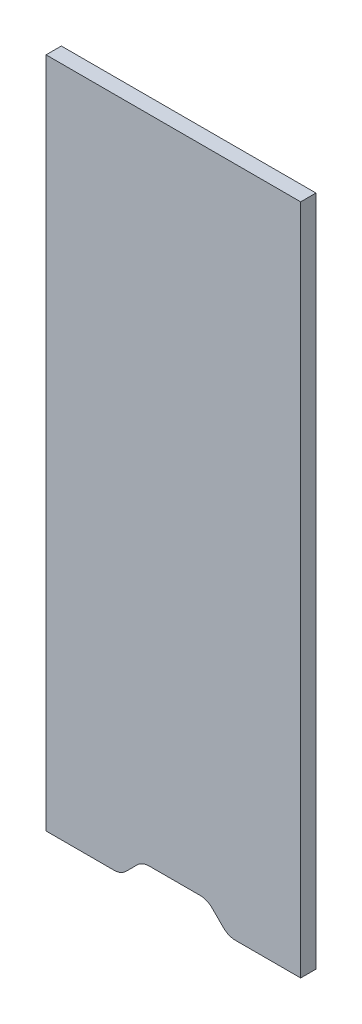
ISO-10303-21;
HEADER;
FILE_DESCRIPTION(('STEP AP214'),'2;1');
FILE_NAME('part.step','',(''),(''),'','','');
FILE_SCHEMA(('AUTOMOTIVE_DESIGN { 1 0 10303 214 1 1 1 1 }'));
ENDSEC;
DATA;
#1=APPLICATION_CONTEXT('core data for automotive mechanical design processes');
#2=APPLICATION_PROTOCOL_DEFINITION('international standard','automotive_design',2000,#1);
#3=PRODUCT_CONTEXT('',#1,'mechanical');
#4=PRODUCT('Part','Part','',(#3));
#5=PRODUCT_RELATED_PRODUCT_CATEGORY('part','',(#4));
#6=PRODUCT_DEFINITION_FORMATION('','',#4);
#7=PRODUCT_DEFINITION_CONTEXT('part definition',#1,'design');
#8=PRODUCT_DEFINITION('design','',#6,#7);
#9=PRODUCT_DEFINITION_SHAPE('','',#8);
#10=(LENGTH_UNIT() NAMED_UNIT(*) SI_UNIT(.MILLI.,.METRE.));
#11=(NAMED_UNIT(*) PLANE_ANGLE_UNIT() SI_UNIT($,.RADIAN.));
#12=(NAMED_UNIT(*) SI_UNIT($,.STERADIAN.) SOLID_ANGLE_UNIT());
#13=UNCERTAINTY_MEASURE_WITH_UNIT(LENGTH_MEASURE(1.E-05),#10,'distance_accuracy_value','');
#14=(GEOMETRIC_REPRESENTATION_CONTEXT(3) GLOBAL_UNCERTAINTY_ASSIGNED_CONTEXT((#13)) GLOBAL_UNIT_ASSIGNED_CONTEXT((#10,
#11,#12)) REPRESENTATION_CONTEXT('',''));
#15=CARTESIAN_POINT('',(0.,0.,0.));
#16=DIRECTION('',(0.,0.,1.));
#17=DIRECTION('',(1.,0.,0.));
#18=AXIS2_PLACEMENT_3D('',#15,#16,#17);
#19=CARTESIAN_POINT('',(0.,0.,18.));
#20=DIRECTION('',(1.,0.,0.));
#21=DIRECTION('',(0.,1.,0.));
#22=AXIS2_PLACEMENT_3D('',#19,#20,#21);
#23=PLANE('',#22);
#24=DIRECTION('',(0.,-1.,0.));
#25=VECTOR('',#24,1.);
#26=CARTESIAN_POINT('',(0.,0.,0.));
#27=LINE('',#26,#25);
#28=CARTESIAN_POINT('',(-3.88578058618805E-13,792.,0.));
#29=VERTEX_POINT('',#28);
#30=CARTESIAN_POINT('',(0.,0.,0.));
#31=VERTEX_POINT('',#30);
#32=EDGE_CURVE('E154',#29,#31,#27,.T.);
#33=ORIENTED_EDGE('',*,*,#32,.T.);
#34=DIRECTION('',(0.,0.,-1.));
#35=VECTOR('',#34,1.);
#36=CARTESIAN_POINT('',(0.,0.,18.));
#37=LINE('',#36,#35);
#38=CARTESIAN_POINT('',(0.,0.,18.));
#39=VERTEX_POINT('',#38);
#40=EDGE_CURVE('E11',#39,#31,#37,.T.);
#41=ORIENTED_EDGE('',*,*,#40,.F.);
#42=DIRECTION('',(0.,-1.,0.));
#43=VECTOR('',#42,1.);
#44=CARTESIAN_POINT('',(0.,0.,18.));
#45=LINE('',#44,#43);
#46=CARTESIAN_POINT('',(-3.88578058618805E-13,792.,18.));
#47=VERTEX_POINT('',#46);
#48=EDGE_CURVE('E176',#47,#39,#45,.T.);
#49=ORIENTED_EDGE('',*,*,#48,.F.);
#50=DIRECTION('',(0.,0.,-1.));
#51=VECTOR('',#50,1.);
#52=CARTESIAN_POINT('',(-3.88578058618805E-13,792.,18.));
#53=LINE('',#52,#51);
#54=EDGE_CURVE('E150',#47,#29,#53,.T.);
#55=ORIENTED_EDGE('',*,*,#54,.T.);
#56=EDGE_LOOP('',(#33,#41,#49,#55));
#57=FACE_BOUND('',#56,.T.);
#58=ADVANCED_FACE('F34',(#57),#23,.F.);
#59=CARTESIAN_POINT('',(0.,0.,18.));
#60=DIRECTION('',(0.,1.,0.));
#61=DIRECTION('',(0.,0.,1.));
#62=AXIS2_PLACEMENT_3D('',#59,#60,#61);
#63=PLANE('',#62);
#64=DIRECTION('',(1.,0.,0.));
#65=VECTOR('',#64,1.);
#66=CARTESIAN_POINT('',(0.,0.,0.));
#67=LINE('',#66,#65);
#68=CARTESIAN_POINT('',(80.,0.,0.));
#69=VERTEX_POINT('',#68);
#70=EDGE_CURVE('E157',#31,#69,#67,.T.);
#71=ORIENTED_EDGE('',*,*,#70,.T.);
#72=DIRECTION('',(0.,0.,-1.));
#73=VECTOR('',#72,1.);
#74=CARTESIAN_POINT('',(80.,0.,18.));
#75=LINE('',#74,#73);
#76=CARTESIAN_POINT('',(80.,0.,18.));
#77=VERTEX_POINT('',#76);
#78=EDGE_CURVE('E42',#77,#69,#75,.T.);
#79=ORIENTED_EDGE('',*,*,#78,.F.);
#80=DIRECTION('',(1.,0.,0.));
#81=VECTOR('',#80,1.);
#82=CARTESIAN_POINT('',(0.,0.,18.));
#83=LINE('',#82,#81);
#84=EDGE_CURVE('E105',#39,#77,#83,.T.);
#85=ORIENTED_EDGE('',*,*,#84,.F.);
#86=ORIENTED_EDGE('',*,*,#40,.T.);
#87=EDGE_LOOP('',(#71,#79,#85,#86));
#88=FACE_BOUND('',#87,.T.);
#89=ADVANCED_FACE('F254',(#88),#63,.F.);
#90=CARTESIAN_POINT('',(80.,20.,18.));
#91=DIRECTION('',(0.,0.,-1.));
#92=DIRECTION('',(-1.,0.,0.));
#93=AXIS2_PLACEMENT_3D('',#90,#91,#92);
#94=CYLINDRICAL_SURFACE('',#93,20.);
#95=CARTESIAN_POINT('',(80.,20.,0.));
#96=DIRECTION('',(0.,0.,1.));
#97=DIRECTION('',(-1.,0.,0.));
#98=AXIS2_PLACEMENT_3D('',#95,#96,#97);
#99=CIRCLE('',#98,20.);
#100=CARTESIAN_POINT('',(94.142135623731,5.85786437626905,0.));
#101=VERTEX_POINT('',#100);
#102=EDGE_CURVE('E159',#69,#101,#99,.T.);
#103=ORIENTED_EDGE('',*,*,#102,.T.);
#104=DIRECTION('',(0.,0.,-1.));
#105=VECTOR('',#104,1.);
#106=CARTESIAN_POINT('',(94.142135623731,5.85786437626905,18.));
#107=LINE('',#106,#105);
#108=CARTESIAN_POINT('',(94.142135623731,5.85786437626905,18.));
#109=VERTEX_POINT('',#108);
#110=EDGE_CURVE('E195',#109,#101,#107,.T.);
#111=ORIENTED_EDGE('',*,*,#110,.F.);
#112=CARTESIAN_POINT('',(80.,20.,18.));
#113=DIRECTION('',(0.,0.,1.));
#114=DIRECTION('',(-1.,0.,0.));
#115=AXIS2_PLACEMENT_3D('',#112,#113,#114);
#116=CIRCLE('',#115,20.);
#117=EDGE_CURVE('E203',#77,#109,#116,.T.);
#118=ORIENTED_EDGE('',*,*,#117,.F.);
#119=ORIENTED_EDGE('',*,*,#78,.T.);
#120=EDGE_LOOP('',(#103,#111,#118,#119));
#121=FACE_BOUND('',#120,.T.);
#122=ADVANCED_FACE('F201',(#121),#94,.T.);
#123=CARTESIAN_POINT('',(107.426406871193,19.1421356237309,18.));
#124=DIRECTION('',(-0.707106781186547,0.707106781186548,0.));
#125=DIRECTION('',(-0.707106781186548,-0.707106781186547,0.));
#126=AXIS2_PLACEMENT_3D('',#123,#124,#125);
#127=PLANE('',#126);
#128=DIRECTION('',(0.707106781186548,0.707106781186547,0.));
#129=VECTOR('',#128,1.);
#130=CARTESIAN_POINT('',(107.426406871193,19.1421356237309,0.));
#131=LINE('',#130,#129);
#132=CARTESIAN_POINT('',(107.426406871193,19.1421356237309,0.));
#133=VERTEX_POINT('',#132);
#134=EDGE_CURVE('E161',#101,#133,#131,.T.);
#135=ORIENTED_EDGE('',*,*,#134,.T.);
#136=DIRECTION('',(0.,0.,-1.));
#137=VECTOR('',#136,1.);
#138=CARTESIAN_POINT('',(107.426406871193,19.1421356237309,18.));
#139=LINE('',#138,#137);
#140=CARTESIAN_POINT('',(107.426406871193,19.1421356237309,18.));
#141=VERTEX_POINT('',#140);
#142=EDGE_CURVE('E192',#141,#133,#139,.T.);
#143=ORIENTED_EDGE('',*,*,#142,.F.);
#144=DIRECTION('',(0.707106781186548,0.707106781186547,0.));
#145=VECTOR('',#144,1.);
#146=CARTESIAN_POINT('',(107.426406871193,19.1421356237309,18.));
#147=LINE('',#146,#145);
#148=EDGE_CURVE('E221',#109,#141,#147,.T.);
#149=ORIENTED_EDGE('',*,*,#148,.F.);
#150=ORIENTED_EDGE('',*,*,#110,.T.);
#151=EDGE_LOOP('',(#135,#143,#149,#150));
#152=FACE_BOUND('',#151,.T.);
#153=ADVANCED_FACE('F212',(#152),#127,.F.);
#154=CARTESIAN_POINT('',(121.568542494924,4.99999999999999,18.));
#155=DIRECTION('',(0.,0.,-1.));
#156=DIRECTION('',(-1.,0.,0.));
#157=AXIS2_PLACEMENT_3D('',#154,#155,#156);
#158=CYLINDRICAL_SURFACE('',#157,20.);
#159=CARTESIAN_POINT('',(121.568542494924,4.99999999999999,0.));
#160=DIRECTION('',(0.,0.,-1.));
#161=DIRECTION('',(1.,0.,0.));
#162=AXIS2_PLACEMENT_3D('',#159,#160,#161);
#163=CIRCLE('',#162,20.);
#164=CARTESIAN_POINT('',(121.568542494924,25.,0.));
#165=VERTEX_POINT('',#164);
#166=EDGE_CURVE('E163',#133,#165,#163,.T.);
#167=ORIENTED_EDGE('',*,*,#166,.T.);
#168=DIRECTION('',(0.,0.,-1.));
#169=VECTOR('',#168,1.);
#170=CARTESIAN_POINT('',(121.568542494924,25.,18.));
#171=LINE('',#170,#169);
#172=CARTESIAN_POINT('',(121.568542494924,25.,18.));
#173=VERTEX_POINT('',#172);
#174=EDGE_CURVE('E189',#173,#165,#171,.T.);
#175=ORIENTED_EDGE('',*,*,#174,.F.);
#176=CARTESIAN_POINT('',(121.568542494924,4.99999999999999,18.));
#177=DIRECTION('',(0.,0.,-1.));
#178=DIRECTION('',(1.,0.,0.));
#179=AXIS2_PLACEMENT_3D('',#176,#177,#178);
#180=CIRCLE('',#179,20.);
#181=EDGE_CURVE('E218',#141,#173,#180,.T.);
#182=ORIENTED_EDGE('',*,*,#181,.F.);
#183=ORIENTED_EDGE('',*,*,#142,.T.);
#184=EDGE_LOOP('',(#167,#175,#182,#183));
#185=FACE_BOUND('',#184,.T.);
#186=ADVANCED_FACE('F216',(#185),#158,.F.);
#187=CARTESIAN_POINT('',(181.568542494924,25.,18.));
#188=DIRECTION('',(0.,1.,0.));
#189=DIRECTION('',(-1.,0.,0.));
#190=AXIS2_PLACEMENT_3D('',#187,#188,#189);
#191=PLANE('',#190);
#192=DIRECTION('',(1.,0.,0.));
#193=VECTOR('',#192,1.);
#194=CARTESIAN_POINT('',(181.568542494924,25.,0.));
#195=LINE('',#194,#193);
#196=CARTESIAN_POINT('',(181.568542494924,25.,0.));
#197=VERTEX_POINT('',#196);
#198=EDGE_CURVE('E165',#165,#197,#195,.T.);
#199=ORIENTED_EDGE('',*,*,#198,.T.);
#200=DIRECTION('',(0.,0.,-1.));
#201=VECTOR('',#200,1.);
#202=CARTESIAN_POINT('',(181.568542494924,25.,18.));
#203=LINE('',#202,#201);
#204=CARTESIAN_POINT('',(181.568542494924,25.,18.));
#205=VERTEX_POINT('',#204);
#206=EDGE_CURVE('E186',#205,#197,#203,.T.);
#207=ORIENTED_EDGE('',*,*,#206,.F.);
#208=DIRECTION('',(1.,0.,0.));
#209=VECTOR('',#208,1.);
#210=CARTESIAN_POINT('',(181.568542494924,25.,18.));
#211=LINE('',#210,#209);
#212=EDGE_CURVE('E220',#173,#205,#211,.T.);
#213=ORIENTED_EDGE('',*,*,#212,.F.);
#214=ORIENTED_EDGE('',*,*,#174,.T.);
#215=EDGE_LOOP('',(#199,#207,#213,#214));
#216=FACE_BOUND('',#215,.T.);
#217=ADVANCED_FACE('F267',(#216),#191,.F.);
#218=CARTESIAN_POINT('',(181.568542494924,5.,18.));
#219=DIRECTION('',(0.,0.,-1.));
#220=DIRECTION('',(-1.,0.,0.));
#221=AXIS2_PLACEMENT_3D('',#218,#219,#220);
#222=CYLINDRICAL_SURFACE('',#221,20.);
#223=CARTESIAN_POINT('',(181.568542494924,5.,0.));
#224=DIRECTION('',(0.,0.,-1.));
#225=DIRECTION('',(1.,0.,0.));
#226=AXIS2_PLACEMENT_3D('',#223,#224,#225);
#227=CIRCLE('',#226,20.);
#228=CARTESIAN_POINT('',(195.710678118655,19.142135623731,0.));
#229=VERTEX_POINT('',#228);
#230=EDGE_CURVE('E167',#197,#229,#227,.T.);
#231=ORIENTED_EDGE('',*,*,#230,.T.);
#232=DIRECTION('',(0.,0.,-1.));
#233=VECTOR('',#232,1.);
#234=CARTESIAN_POINT('',(195.710678118655,19.142135623731,18.));
#235=LINE('',#234,#233);
#236=CARTESIAN_POINT('',(195.710678118655,19.142135623731,18.));
#237=VERTEX_POINT('',#236);
#238=EDGE_CURVE('E183',#237,#229,#235,.T.);
#239=ORIENTED_EDGE('',*,*,#238,.F.);
#240=CARTESIAN_POINT('',(181.568542494924,5.,18.));
#241=DIRECTION('',(0.,0.,-1.));
#242=DIRECTION('',(1.,0.,0.));
#243=AXIS2_PLACEMENT_3D('',#240,#241,#242);
#244=CIRCLE('',#243,20.);
#245=EDGE_CURVE('E223',#205,#237,#244,.T.);
#246=ORIENTED_EDGE('',*,*,#245,.F.);
#247=ORIENTED_EDGE('',*,*,#206,.T.);
#248=EDGE_LOOP('',(#231,#239,#246,#247));
#249=FACE_BOUND('',#248,.T.);
#250=ADVANCED_FACE('F270',(#249),#222,.F.);
#251=CARTESIAN_POINT('',(208.994949366117,5.85786437626905,18.));
#252=DIRECTION('',(0.707106781186548,0.707106781186547,0.));
#253=DIRECTION('',(-0.707106781186547,0.707106781186548,0.));
#254=AXIS2_PLACEMENT_3D('',#251,#252,#253);
#255=PLANE('',#254);
#256=DIRECTION('',(0.707106781186548,-0.707106781186548,0.));
#257=VECTOR('',#256,1.);
#258=CARTESIAN_POINT('',(208.994949366117,5.85786437626905,0.));
#259=LINE('',#258,#257);
#260=CARTESIAN_POINT('',(208.994949366117,5.85786437626905,0.));
#261=VERTEX_POINT('',#260);
#262=EDGE_CURVE('E169',#229,#261,#259,.T.);
#263=ORIENTED_EDGE('',*,*,#262,.T.);
#264=DIRECTION('',(0.,0.,-1.));
#265=VECTOR('',#264,1.);
#266=CARTESIAN_POINT('',(208.994949366117,5.85786437626905,18.));
#267=LINE('',#266,#265);
#268=CARTESIAN_POINT('',(208.994949366117,5.85786437626905,18.));
#269=VERTEX_POINT('',#268);
#270=EDGE_CURVE('E180',#269,#261,#267,.T.);
#271=ORIENTED_EDGE('',*,*,#270,.F.);
#272=DIRECTION('',(0.707106781186548,-0.707106781186548,0.));
#273=VECTOR('',#272,1.);
#274=CARTESIAN_POINT('',(208.994949366117,5.85786437626905,18.));
#275=LINE('',#274,#273);
#276=EDGE_CURVE('E229',#237,#269,#275,.T.);
#277=ORIENTED_EDGE('',*,*,#276,.F.);
#278=ORIENTED_EDGE('',*,*,#238,.T.);
#279=EDGE_LOOP('',(#263,#271,#277,#278));
#280=FACE_BOUND('',#279,.T.);
#281=ADVANCED_FACE('F235',(#280),#255,.F.);
#282=CARTESIAN_POINT('',(223.137084989848,20.,18.));
#283=DIRECTION('',(0.,0.,-1.));
#284=DIRECTION('',(-1.,0.,0.));
#285=AXIS2_PLACEMENT_3D('',#282,#283,#284);
#286=CYLINDRICAL_SURFACE('',#285,20.);
#287=CARTESIAN_POINT('',(223.137084989848,20.,0.));
#288=DIRECTION('',(0.,0.,1.));
#289=DIRECTION('',(1.,0.,0.));
#290=AXIS2_PLACEMENT_3D('',#287,#288,#289);
#291=CIRCLE('',#290,20.);
#292=CARTESIAN_POINT('',(223.137084989848,0.,0.));
#293=VERTEX_POINT('',#292);
#294=EDGE_CURVE('E171',#261,#293,#291,.T.);
#295=ORIENTED_EDGE('',*,*,#294,.T.);
#296=DIRECTION('',(0.,0.,-1.));
#297=VECTOR('',#296,1.);
#298=CARTESIAN_POINT('',(223.137084989848,0.,18.));
#299=LINE('',#298,#297);
#300=CARTESIAN_POINT('',(223.137084989848,0.,18.));
#301=VERTEX_POINT('',#300);
#302=EDGE_CURVE('E145',#301,#293,#299,.T.);
#303=ORIENTED_EDGE('',*,*,#302,.F.);
#304=CARTESIAN_POINT('',(223.137084989848,20.,18.));
#305=DIRECTION('',(0.,0.,1.));
#306=DIRECTION('',(1.,0.,0.));
#307=AXIS2_PLACEMENT_3D('',#304,#305,#306);
#308=CIRCLE('',#307,20.);
#309=EDGE_CURVE('E136',#269,#301,#308,.T.);
#310=ORIENTED_EDGE('',*,*,#309,.F.);
#311=ORIENTED_EDGE('',*,*,#270,.T.);
#312=EDGE_LOOP('',(#295,#303,#310,#311));
#313=FACE_BOUND('',#312,.T.);
#314=ADVANCED_FACE('F239',(#313),#286,.T.);
#315=CARTESIAN_POINT('',(223.137084989848,0.,18.));
#316=DIRECTION('',(0.,1.,0.));
#317=DIRECTION('',(0.,0.,1.));
#318=AXIS2_PLACEMENT_3D('',#315,#316,#317);
#319=PLANE('',#318);
#320=DIRECTION('',(1.,0.,0.));
#321=VECTOR('',#320,1.);
#322=CARTESIAN_POINT('',(223.137084989848,0.,0.));
#323=LINE('',#322,#321);
#324=CARTESIAN_POINT('',(300.,0.,0.));
#325=VERTEX_POINT('',#324);
#326=EDGE_CURVE('E144',#293,#325,#323,.T.);
#327=ORIENTED_EDGE('',*,*,#326,.T.);
#328=DIRECTION('',(0.,0.,-1.));
#329=VECTOR('',#328,1.);
#330=CARTESIAN_POINT('',(300.,0.,18.));
#331=LINE('',#330,#329);
#332=CARTESIAN_POINT('',(300.,0.,18.));
#333=VERTEX_POINT('',#332);
#334=EDGE_CURVE('E141',#333,#325,#331,.T.);
#335=ORIENTED_EDGE('',*,*,#334,.F.);
#336=DIRECTION('',(1.,0.,0.));
#337=VECTOR('',#336,1.);
#338=CARTESIAN_POINT('',(223.137084989848,0.,18.));
#339=LINE('',#338,#337);
#340=EDGE_CURVE('E130',#301,#333,#339,.T.);
#341=ORIENTED_EDGE('',*,*,#340,.F.);
#342=ORIENTED_EDGE('',*,*,#302,.T.);
#343=EDGE_LOOP('',(#327,#335,#341,#342));
#344=FACE_BOUND('',#343,.T.);
#345=ADVANCED_FACE('F142',(#344),#319,.F.);
#346=CARTESIAN_POINT('',(300.,0.,18.));
#347=DIRECTION('',(-1.,0.,0.));
#348=DIRECTION('',(0.,-1.,0.));
#349=AXIS2_PLACEMENT_3D('',#346,#347,#348);
#350=PLANE('',#349);
#351=DIRECTION('',(0.,1.,0.));
#352=VECTOR('',#351,1.);
#353=CARTESIAN_POINT('',(300.,0.,0.));
#354=LINE('',#353,#352);
#355=CARTESIAN_POINT('',(300.,792.,0.));
#356=VERTEX_POINT('',#355);
#357=EDGE_CURVE('E91',#325,#356,#354,.T.);
#358=ORIENTED_EDGE('',*,*,#357,.T.);
#359=DIRECTION('',(0.,0.,-1.));
#360=VECTOR('',#359,1.);
#361=CARTESIAN_POINT('',(300.,792.,18.));
#362=LINE('',#361,#360);
#363=CARTESIAN_POINT('',(300.,792.,18.));
#364=VERTEX_POINT('',#363);
#365=EDGE_CURVE('E146',#364,#356,#362,.T.);
#366=ORIENTED_EDGE('',*,*,#365,.F.);
#367=DIRECTION('',(0.,1.,0.));
#368=VECTOR('',#367,1.);
#369=CARTESIAN_POINT('',(300.,0.,18.));
#370=LINE('',#369,#368);
#371=EDGE_CURVE('E134',#333,#364,#370,.T.);
#372=ORIENTED_EDGE('',*,*,#371,.F.);
#373=ORIENTED_EDGE('',*,*,#334,.T.);
#374=EDGE_LOOP('',(#358,#366,#372,#373));
#375=FACE_BOUND('',#374,.T.);
#376=ADVANCED_FACE('F148',(#375),#350,.F.);
#377=CARTESIAN_POINT('',(-3.88578058618805E-13,792.,18.));
#378=DIRECTION('',(0.,-1.,0.));
#379=DIRECTION('',(0.,0.,-1.));
#380=AXIS2_PLACEMENT_3D('',#377,#378,#379);
#381=PLANE('',#380);
#382=DIRECTION('',(-1.,0.,0.));
#383=VECTOR('',#382,1.);
#384=CARTESIAN_POINT('',(-3.88578058618805E-13,792.,0.));
#385=LINE('',#384,#383);
#386=EDGE_CURVE('E97',#356,#29,#385,.T.);
#387=ORIENTED_EDGE('',*,*,#386,.T.);
#388=ORIENTED_EDGE('',*,*,#54,.F.);
#389=DIRECTION('',(-1.,0.,0.));
#390=VECTOR('',#389,1.);
#391=CARTESIAN_POINT('',(-3.88578058618805E-13,792.,18.));
#392=LINE('',#391,#390);
#393=EDGE_CURVE('E50',#364,#47,#392,.T.);
#394=ORIENTED_EDGE('',*,*,#393,.F.);
#395=ORIENTED_EDGE('',*,*,#365,.T.);
#396=EDGE_LOOP('',(#387,#388,#394,#395));
#397=FACE_BOUND('',#396,.T.);
#398=ADVANCED_FACE('F243',(#397),#381,.F.);
#399=CARTESIAN_POINT('',(223.137084989848,20.,18.));
#400=DIRECTION('',(0.,0.,1.));
#401=DIRECTION('',(1.,0.,0.));
#402=AXIS2_PLACEMENT_3D('',#399,#400,#401);
#403=PLANE('',#402);
#404=ORIENTED_EDGE('',*,*,#48,.T.);
#405=ORIENTED_EDGE('',*,*,#84,.T.);
#406=ORIENTED_EDGE('',*,*,#117,.T.);
#407=ORIENTED_EDGE('',*,*,#148,.T.);
#408=ORIENTED_EDGE('',*,*,#181,.T.);
#409=ORIENTED_EDGE('',*,*,#212,.T.);
#410=ORIENTED_EDGE('',*,*,#245,.T.);
#411=ORIENTED_EDGE('',*,*,#276,.T.);
#412=ORIENTED_EDGE('',*,*,#309,.T.);
#413=ORIENTED_EDGE('',*,*,#340,.T.);
#414=ORIENTED_EDGE('',*,*,#371,.T.);
#415=ORIENTED_EDGE('',*,*,#393,.T.);
#416=EDGE_LOOP('',(#404,#405,#406,#407,#408,#409,#410,#411,#412,#413,#414,#415));
#417=FACE_BOUND('',#416,.T.);
#418=ADVANCED_FACE('F132',(#417),#403,.T.);
#419=CARTESIAN_POINT('',(223.137084989848,20.,0.));
#420=DIRECTION('',(0.,0.,1.));
#421=DIRECTION('',(1.,0.,0.));
#422=AXIS2_PLACEMENT_3D('',#419,#420,#421);
#423=PLANE('',#422);
#424=ORIENTED_EDGE('',*,*,#32,.F.);
#425=ORIENTED_EDGE('',*,*,#386,.F.);
#426=ORIENTED_EDGE('',*,*,#357,.F.);
#427=ORIENTED_EDGE('',*,*,#326,.F.);
#428=ORIENTED_EDGE('',*,*,#294,.F.);
#429=ORIENTED_EDGE('',*,*,#262,.F.);
#430=ORIENTED_EDGE('',*,*,#230,.F.);
#431=ORIENTED_EDGE('',*,*,#198,.F.);
#432=ORIENTED_EDGE('',*,*,#166,.F.);
#433=ORIENTED_EDGE('',*,*,#134,.F.);
#434=ORIENTED_EDGE('',*,*,#102,.F.);
#435=ORIENTED_EDGE('',*,*,#70,.F.);
#436=EDGE_LOOP('',(#424,#425,#426,#427,#428,#429,#430,#431,#432,#433,#434,#435));
#437=FACE_BOUND('',#436,.T.);
#438=ADVANCED_FACE('F207',(#437),#423,.F.);
#439=CLOSED_SHELL('',(#58,#89,#122,#153,#186,#217,#250,#281,#314,#345,#376,#398,#418,#438));
#440=MANIFOLD_SOLID_BREP('B2',#439);
#441=ADVANCED_BREP_SHAPE_REPRESENTATION('',(#18,#440),#14);
#442=SHAPE_DEFINITION_REPRESENTATION(#9,#441);
ENDSEC;
END-ISO-10303-21;
